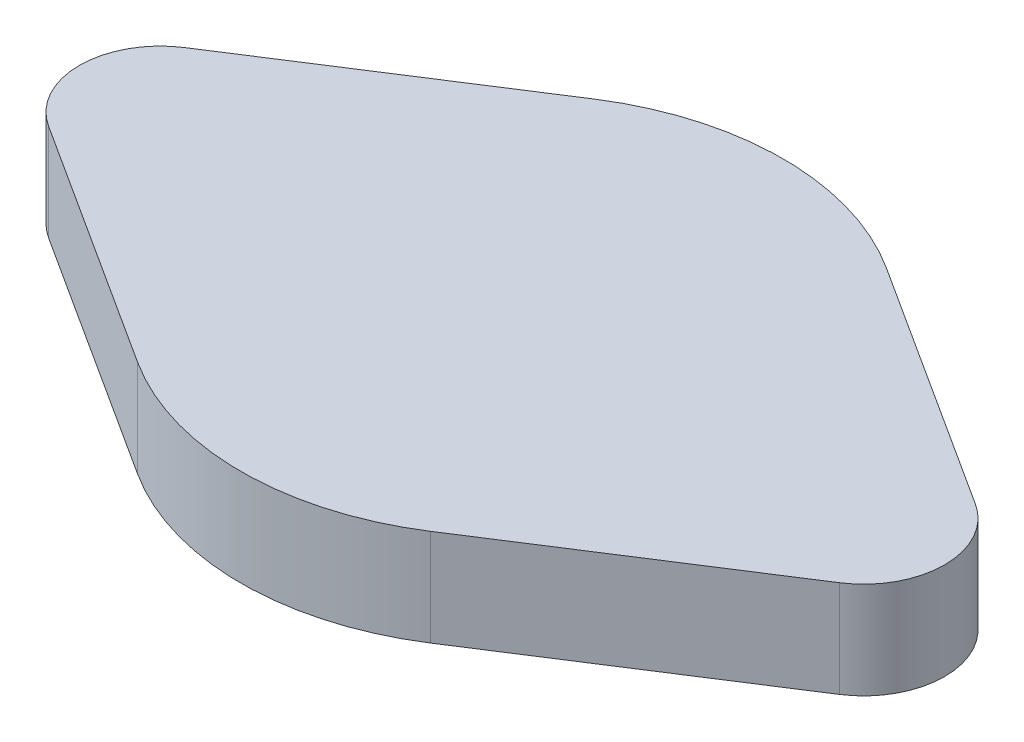
ISO-10303-21;
HEADER;
FILE_DESCRIPTION(('STEP AP214'),'2;1');
FILE_NAME('part.step','',(''),(''),'','','');
FILE_SCHEMA(('AUTOMOTIVE_DESIGN { 1 0 10303 214 1 1 1 1 }'));
ENDSEC;
DATA;
#1=APPLICATION_CONTEXT('core data for automotive mechanical design processes');
#2=APPLICATION_PROTOCOL_DEFINITION('international standard','automotive_design',2000,#1);
#3=PRODUCT_CONTEXT('',#1,'mechanical');
#4=PRODUCT('Part','Part','',(#3));
#5=PRODUCT_RELATED_PRODUCT_CATEGORY('part','',(#4));
#6=PRODUCT_DEFINITION_FORMATION('','',#4);
#7=PRODUCT_DEFINITION_CONTEXT('part definition',#1,'design');
#8=PRODUCT_DEFINITION('design','',#6,#7);
#9=PRODUCT_DEFINITION_SHAPE('','',#8);
#10=(LENGTH_UNIT() NAMED_UNIT(*) SI_UNIT(.MILLI.,.METRE.));
#11=(NAMED_UNIT(*) PLANE_ANGLE_UNIT() SI_UNIT($,.RADIAN.));
#12=(NAMED_UNIT(*) SI_UNIT($,.STERADIAN.) SOLID_ANGLE_UNIT());
#13=UNCERTAINTY_MEASURE_WITH_UNIT(LENGTH_MEASURE(1.E-05),#10,'distance_accuracy_value','');
#14=(GEOMETRIC_REPRESENTATION_CONTEXT(3) GLOBAL_UNCERTAINTY_ASSIGNED_CONTEXT((#13)) GLOBAL_UNIT_ASSIGNED_CONTEXT((#10,
#11,#12)) REPRESENTATION_CONTEXT('',''));
#15=CARTESIAN_POINT('',(0.,0.,0.));
#16=DIRECTION('',(0.,0.,1.));
#17=DIRECTION('',(1.,0.,0.));
#18=AXIS2_PLACEMENT_3D('',#15,#16,#17);
#19=CARTESIAN_POINT('',(18.1754264805429,5.,0.));
#20=DIRECTION('',(0.,-1.,0.));
#21=DIRECTION('',(0.,0.,-1.));
#22=AXIS2_PLACEMENT_3D('',#19,#20,#21);
#23=CYLINDRICAL_SURFACE('',#22,4.17542648054294);
#24=CARTESIAN_POINT('',(18.1754264805429,0.,0.));
#25=DIRECTION('',(0.,1.,0.));
#26=DIRECTION('',(0.,0.,-1.));
#27=AXIS2_PLACEMENT_3D('',#24,#25,#26);
#28=CIRCLE('',#27,4.17542648054294);
#29=CARTESIAN_POINT('',(20.4324180552439,0.,3.51285856905002));
#30=VERTEX_POINT('',#29);
#31=CARTESIAN_POINT('',(20.4324180552439,0.,-3.51285856905002));
#32=VERTEX_POINT('',#31);
#33=EDGE_CURVE('E129',#30,#32,#28,.T.);
#34=ORIENTED_EDGE('',*,*,#33,.T.);
#35=DIRECTION('',(0.,-1.,0.));
#36=VECTOR('',#35,1.);
#37=CARTESIAN_POINT('',(20.4324180552439,5.,-3.51285856905002));
#38=LINE('',#37,#36);
#39=CARTESIAN_POINT('',(20.4324180552439,5.,-3.51285856905002));
#40=VERTEX_POINT('',#39);
#41=EDGE_CURVE('E11',#40,#32,#38,.T.);
#42=ORIENTED_EDGE('',*,*,#41,.F.);
#43=CARTESIAN_POINT('',(18.1754264805429,5.,0.));
#44=DIRECTION('',(0.,1.,0.));
#45=DIRECTION('',(0.,0.,-1.));
#46=AXIS2_PLACEMENT_3D('',#43,#44,#45);
#47=CIRCLE('',#46,4.17542648054294);
#48=CARTESIAN_POINT('',(20.4324180552439,5.,3.51285856905002));
#49=VERTEX_POINT('',#48);
#50=EDGE_CURVE('E143',#49,#40,#47,.T.);
#51=ORIENTED_EDGE('',*,*,#50,.F.);
#52=DIRECTION('',(0.,-1.,0.));
#53=VECTOR('',#52,1.);
#54=CARTESIAN_POINT('',(20.4324180552439,5.,3.51285856905002));
#55=LINE('',#54,#53);
#56=EDGE_CURVE('E125',#49,#30,#55,.T.);
#57=ORIENTED_EDGE('',*,*,#56,.T.);
#58=EDGE_LOOP('',(#34,#42,#51,#57));
#59=FACE_BOUND('',#58,.T.);
#60=ADVANCED_FACE('F33',(#59),#23,.T.);
#61=CARTESIAN_POINT('',(20.4324180552439,5.,-3.51285856905002));
#62=DIRECTION('',(-0.540541567482579,0.,0.841317308643699));
#63=DIRECTION('',(0.841317308643699,0.,0.540541567482579));
#64=AXIS2_PLACEMENT_3D('',#61,#62,#63);
#65=PLANE('',#64);
#66=DIRECTION('',(-0.841317308643699,0.,-0.540541567482579));
#67=VECTOR('',#66,1.);
#68=CARTESIAN_POINT('',(20.4324180552439,0.,-3.51285856905002));
#69=LINE('',#68,#67);
#70=CARTESIAN_POINT('',(7.56758194475611,0.,-11.7784423210118));
#71=VERTEX_POINT('',#70);
#72=EDGE_CURVE('E132',#32,#71,#69,.T.);
#73=ORIENTED_EDGE('',*,*,#72,.T.);
#74=DIRECTION('',(0.,-1.,0.));
#75=VECTOR('',#74,1.);
#76=CARTESIAN_POINT('',(7.56758194475611,5.,-11.7784423210118));
#77=LINE('',#76,#75);
#78=CARTESIAN_POINT('',(7.56758194475611,5.,-11.7784423210118));
#79=VERTEX_POINT('',#78);
#80=EDGE_CURVE('E41',#79,#71,#77,.T.);
#81=ORIENTED_EDGE('',*,*,#80,.F.);
#82=DIRECTION('',(-0.841317308643699,0.,-0.540541567482579));
#83=VECTOR('',#82,1.);
#84=CARTESIAN_POINT('',(20.4324180552439,5.,-3.51285856905002));
#85=LINE('',#84,#83);
#86=EDGE_CURVE('E92',#40,#79,#85,.T.);
#87=ORIENTED_EDGE('',*,*,#86,.F.);
#88=ORIENTED_EDGE('',*,*,#41,.T.);
#89=EDGE_LOOP('',(#73,#81,#87,#88));
#90=FACE_BOUND('',#89,.T.);
#91=ADVANCED_FACE('F178',(#90),#65,.F.);
#92=CARTESIAN_POINT('',(0.,5.,0.));
#93=DIRECTION('',(0.,-1.,0.));
#94=DIRECTION('',(0.,0.,-1.));
#95=AXIS2_PLACEMENT_3D('',#92,#93,#94);
#96=CYLINDRICAL_SURFACE('',#95,14.);
#97=CARTESIAN_POINT('',(0.,0.,0.));
#98=DIRECTION('',(0.,1.,0.));
#99=DIRECTION('',(0.,0.,1.));
#100=AXIS2_PLACEMENT_3D('',#97,#98,#99);
#101=CIRCLE('',#100,14.);
#102=CARTESIAN_POINT('',(-7.56758194475611,0.,-11.7784423210118));
#103=VERTEX_POINT('',#102);
#104=EDGE_CURVE('E134',#71,#103,#101,.T.);
#105=ORIENTED_EDGE('',*,*,#104,.T.);
#106=DIRECTION('',(0.,-1.,0.));
#107=VECTOR('',#106,1.);
#108=CARTESIAN_POINT('',(-7.56758194475611,5.,-11.7784423210118));
#109=LINE('',#108,#107);
#110=CARTESIAN_POINT('',(-7.56758194475611,5.,-11.7784423210118));
#111=VERTEX_POINT('',#110);
#112=EDGE_CURVE('E150',#111,#103,#109,.T.);
#113=ORIENTED_EDGE('',*,*,#112,.F.);
#114=CARTESIAN_POINT('',(0.,5.,0.));
#115=DIRECTION('',(0.,1.,0.));
#116=DIRECTION('',(0.,0.,1.));
#117=AXIS2_PLACEMENT_3D('',#114,#115,#116);
#118=CIRCLE('',#117,14.);
#119=EDGE_CURVE('E158',#79,#111,#118,.T.);
#120=ORIENTED_EDGE('',*,*,#119,.F.);
#121=ORIENTED_EDGE('',*,*,#80,.T.);
#122=EDGE_LOOP('',(#105,#113,#120,#121));
#123=FACE_BOUND('',#122,.T.);
#124=ADVANCED_FACE('F156',(#123),#96,.T.);
#125=CARTESIAN_POINT('',(-20.4324180552439,5.,-3.51285856905002));
#126=DIRECTION('',(0.540541567482579,0.,0.841317308643699));
#127=DIRECTION('',(0.841317308643699,0.,-0.540541567482579));
#128=AXIS2_PLACEMENT_3D('',#125,#126,#127);
#129=PLANE('',#128);
#130=DIRECTION('',(-0.841317308643699,0.,0.540541567482579));
#131=VECTOR('',#130,1.);
#132=CARTESIAN_POINT('',(-20.4324180552439,0.,-3.51285856905002));
#133=LINE('',#132,#131);
#134=CARTESIAN_POINT('',(-20.4324180552439,0.,-3.51285856905002));
#135=VERTEX_POINT('',#134);
#136=EDGE_CURVE('E136',#103,#135,#133,.T.);
#137=ORIENTED_EDGE('',*,*,#136,.T.);
#138=DIRECTION('',(0.,-1.,0.));
#139=VECTOR('',#138,1.);
#140=CARTESIAN_POINT('',(-20.4324180552439,5.,-3.51285856905002));
#141=LINE('',#140,#139);
#142=CARTESIAN_POINT('',(-20.4324180552439,5.,-3.51285856905002));
#143=VERTEX_POINT('',#142);
#144=EDGE_CURVE('E147',#143,#135,#141,.T.);
#145=ORIENTED_EDGE('',*,*,#144,.F.);
#146=DIRECTION('',(-0.841317308643699,0.,0.540541567482579));
#147=VECTOR('',#146,1.);
#148=CARTESIAN_POINT('',(-20.4324180552439,5.,-3.51285856905002));
#149=LINE('',#148,#147);
#150=EDGE_CURVE('E170',#111,#143,#149,.T.);
#151=ORIENTED_EDGE('',*,*,#150,.F.);
#152=ORIENTED_EDGE('',*,*,#112,.T.);
#153=EDGE_LOOP('',(#137,#145,#151,#152));
#154=FACE_BOUND('',#153,.T.);
#155=ADVANCED_FACE('F166',(#154),#129,.F.);
#156=CARTESIAN_POINT('',(-18.1754264805429,5.,0.));
#157=DIRECTION('',(0.,-1.,0.));
#158=DIRECTION('',(0.,0.,-1.));
#159=AXIS2_PLACEMENT_3D('',#156,#157,#158);
#160=CYLINDRICAL_SURFACE('',#159,4.17542648054294);
#161=CARTESIAN_POINT('',(-18.1754264805429,0.,0.));
#162=DIRECTION('',(0.,1.,0.));
#163=DIRECTION('',(0.,0.,1.));
#164=AXIS2_PLACEMENT_3D('',#161,#162,#163);
#165=CIRCLE('',#164,4.17542648054294);
#166=CARTESIAN_POINT('',(-20.4324180552439,0.,3.51285856905002));
#167=VERTEX_POINT('',#166);
#168=EDGE_CURVE('E138',#135,#167,#165,.T.);
#169=ORIENTED_EDGE('',*,*,#168,.T.);
#170=DIRECTION('',(0.,-1.,0.));
#171=VECTOR('',#170,1.);
#172=CARTESIAN_POINT('',(-20.4324180552439,5.,3.51285856905002));
#173=LINE('',#172,#171);
#174=CARTESIAN_POINT('',(-20.4324180552439,5.,3.51285856905002));
#175=VERTEX_POINT('',#174);
#176=EDGE_CURVE('E120',#175,#167,#173,.T.);
#177=ORIENTED_EDGE('',*,*,#176,.F.);
#178=CARTESIAN_POINT('',(-18.1754264805429,5.,0.));
#179=DIRECTION('',(0.,1.,0.));
#180=DIRECTION('',(0.,0.,1.));
#181=AXIS2_PLACEMENT_3D('',#178,#179,#180);
#182=CIRCLE('',#181,4.17542648054294);
#183=EDGE_CURVE('E111',#143,#175,#182,.T.);
#184=ORIENTED_EDGE('',*,*,#183,.F.);
#185=ORIENTED_EDGE('',*,*,#144,.T.);
#186=EDGE_LOOP('',(#169,#177,#184,#185));
#187=FACE_BOUND('',#186,.T.);
#188=ADVANCED_FACE('F169',(#187),#160,.T.);
#189=CARTESIAN_POINT('',(-20.4324180552439,5.,3.51285856905002));
#190=DIRECTION('',(0.540541567482579,0.,-0.841317308643699));
#191=DIRECTION('',(-0.841317308643699,0.,-0.540541567482579));
#192=AXIS2_PLACEMENT_3D('',#189,#190,#191);
#193=PLANE('',#192);
#194=DIRECTION('',(0.841317308643699,0.,0.540541567482579));
#195=VECTOR('',#194,1.);
#196=CARTESIAN_POINT('',(-20.4324180552439,0.,3.51285856905002));
#197=LINE('',#196,#195);
#198=CARTESIAN_POINT('',(-7.5675819447561,0.,11.7784423210118));
#199=VERTEX_POINT('',#198);
#200=EDGE_CURVE('E119',#167,#199,#197,.T.);
#201=ORIENTED_EDGE('',*,*,#200,.T.);
#202=DIRECTION('',(0.,-1.,0.));
#203=VECTOR('',#202,1.);
#204=CARTESIAN_POINT('',(-7.5675819447561,5.,11.7784423210118));
#205=LINE('',#204,#203);
#206=CARTESIAN_POINT('',(-7.5675819447561,5.,11.7784423210118));
#207=VERTEX_POINT('',#206);
#208=EDGE_CURVE('E116',#207,#199,#205,.T.);
#209=ORIENTED_EDGE('',*,*,#208,.F.);
#210=DIRECTION('',(0.841317308643699,0.,0.540541567482579));
#211=VECTOR('',#210,1.);
#212=CARTESIAN_POINT('',(-20.4324180552439,5.,3.51285856905002));
#213=LINE('',#212,#211);
#214=EDGE_CURVE('E105',#175,#207,#213,.T.);
#215=ORIENTED_EDGE('',*,*,#214,.F.);
#216=ORIENTED_EDGE('',*,*,#176,.T.);
#217=EDGE_LOOP('',(#201,#209,#215,#216));
#218=FACE_BOUND('',#217,.T.);
#219=ADVANCED_FACE('F117',(#218),#193,.F.);
#220=CARTESIAN_POINT('',(0.,5.,0.));
#221=DIRECTION('',(0.,-1.,0.));
#222=DIRECTION('',(0.,0.,-1.));
#223=AXIS2_PLACEMENT_3D('',#220,#221,#222);
#224=CYLINDRICAL_SURFACE('',#223,14.);
#225=CARTESIAN_POINT('',(0.,0.,0.));
#226=DIRECTION('',(0.,1.,0.));
#227=DIRECTION('',(0.,0.,1.));
#228=AXIS2_PLACEMENT_3D('',#225,#226,#227);
#229=CIRCLE('',#228,14.);
#230=CARTESIAN_POINT('',(7.56758194475611,0.,11.7784423210118));
#231=VERTEX_POINT('',#230);
#232=EDGE_CURVE('E78',#199,#231,#229,.T.);
#233=ORIENTED_EDGE('',*,*,#232,.T.);
#234=DIRECTION('',(0.,-1.,0.));
#235=VECTOR('',#234,1.);
#236=CARTESIAN_POINT('',(7.56758194475611,5.,11.7784423210118));
#237=LINE('',#236,#235);
#238=CARTESIAN_POINT('',(7.56758194475611,5.,11.7784423210118));
#239=VERTEX_POINT('',#238);
#240=EDGE_CURVE('E121',#239,#231,#237,.T.);
#241=ORIENTED_EDGE('',*,*,#240,.F.);
#242=CARTESIAN_POINT('',(0.,5.,0.));
#243=DIRECTION('',(0.,1.,0.));
#244=DIRECTION('',(0.,0.,1.));
#245=AXIS2_PLACEMENT_3D('',#242,#243,#244);
#246=CIRCLE('',#245,14.);
#247=EDGE_CURVE('E109',#207,#239,#246,.T.);
#248=ORIENTED_EDGE('',*,*,#247,.F.);
#249=ORIENTED_EDGE('',*,*,#208,.T.);
#250=EDGE_LOOP('',(#233,#241,#248,#249));
#251=FACE_BOUND('',#250,.T.);
#252=ADVANCED_FACE('F123',(#251),#224,.T.);
#253=CARTESIAN_POINT('',(20.4324180552439,5.,3.51285856905002));
#254=DIRECTION('',(-0.540541567482579,0.,-0.841317308643699));
#255=DIRECTION('',(-0.841317308643699,0.,0.540541567482579));
#256=AXIS2_PLACEMENT_3D('',#253,#254,#255);
#257=PLANE('',#256);
#258=DIRECTION('',(0.841317308643699,0.,-0.540541567482579));
#259=VECTOR('',#258,1.);
#260=CARTESIAN_POINT('',(20.4324180552439,0.,3.51285856905002));
#261=LINE('',#260,#259);
#262=EDGE_CURVE('E84',#231,#30,#261,.T.);
#263=ORIENTED_EDGE('',*,*,#262,.T.);
#264=ORIENTED_EDGE('',*,*,#56,.F.);
#265=DIRECTION('',(0.841317308643699,0.,-0.540541567482579));
#266=VECTOR('',#265,1.);
#267=CARTESIAN_POINT('',(20.4324180552439,5.,3.51285856905002));
#268=LINE('',#267,#266);
#269=EDGE_CURVE('E49',#239,#49,#268,.T.);
#270=ORIENTED_EDGE('',*,*,#269,.F.);
#271=ORIENTED_EDGE('',*,*,#240,.T.);
#272=EDGE_LOOP('',(#263,#264,#270,#271));
#273=FACE_BOUND('',#272,.T.);
#274=ADVANCED_FACE('F194',(#273),#257,.F.);
#275=CARTESIAN_POINT('',(18.1754264805429,5.,0.));
#276=DIRECTION('',(0.,-1.,0.));
#277=DIRECTION('',(0.,0.,-1.));
#278=AXIS2_PLACEMENT_3D('',#275,#276,#277);
#279=PLANE('',#278);
#280=ORIENTED_EDGE('',*,*,#50,.T.);
#281=ORIENTED_EDGE('',*,*,#86,.T.);
#282=ORIENTED_EDGE('',*,*,#119,.T.);
#283=ORIENTED_EDGE('',*,*,#150,.T.);
#284=ORIENTED_EDGE('',*,*,#183,.T.);
#285=ORIENTED_EDGE('',*,*,#214,.T.);
#286=ORIENTED_EDGE('',*,*,#247,.T.);
#287=ORIENTED_EDGE('',*,*,#269,.T.);
#288=EDGE_LOOP('',(#280,#281,#282,#283,#284,#285,#286,#287));
#289=FACE_BOUND('',#288,.T.);
#290=ADVANCED_FACE('F107',(#289),#279,.F.);
#291=CARTESIAN_POINT('',(18.1754264805429,0.,0.));
#292=DIRECTION('',(0.,-1.,0.));
#293=DIRECTION('',(0.,0.,-1.));
#294=AXIS2_PLACEMENT_3D('',#291,#292,#293);
#295=PLANE('',#294);
#296=ORIENTED_EDGE('',*,*,#33,.F.);
#297=ORIENTED_EDGE('',*,*,#262,.F.);
#298=ORIENTED_EDGE('',*,*,#232,.F.);
#299=ORIENTED_EDGE('',*,*,#200,.F.);
#300=ORIENTED_EDGE('',*,*,#168,.F.);
#301=ORIENTED_EDGE('',*,*,#136,.F.);
#302=ORIENTED_EDGE('',*,*,#104,.F.);
#303=ORIENTED_EDGE('',*,*,#72,.F.);
#304=EDGE_LOOP('',(#296,#297,#298,#299,#300,#301,#302,#303));
#305=FACE_BOUND('',#304,.T.);
#306=ADVANCED_FACE('F162',(#305),#295,.T.);
#307=CLOSED_SHELL('',(#60,#91,#124,#155,#188,#219,#252,#274,#290,#306));
#308=MANIFOLD_SOLID_BREP('B2',#307);
#309=ADVANCED_BREP_SHAPE_REPRESENTATION('',(#18,#308),#14);
#310=SHAPE_DEFINITION_REPRESENTATION(#9,#309);
ENDSEC;
END-ISO-10303-21;
